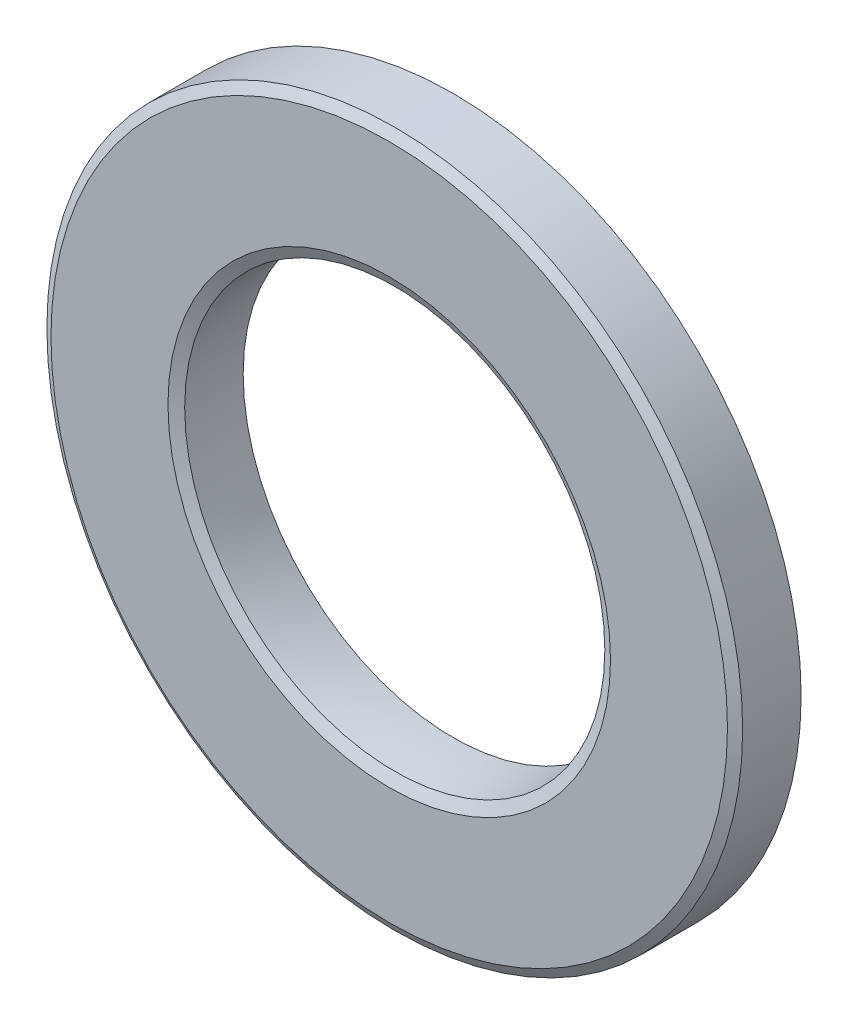
ISO-10303-21;
HEADER;
FILE_DESCRIPTION(('STEP AP214'),'2;1');
FILE_NAME('part.step','',(''),(''),'','','');
FILE_SCHEMA(('AUTOMOTIVE_DESIGN { 1 0 10303 214 1 1 1 1 }'));
ENDSEC;
DATA;
#1=APPLICATION_CONTEXT('core data for automotive mechanical design processes');
#2=APPLICATION_PROTOCOL_DEFINITION('international standard','automotive_design',2000,#1);
#3=PRODUCT_CONTEXT('',#1,'mechanical');
#4=PRODUCT('Part','Part','',(#3));
#5=PRODUCT_RELATED_PRODUCT_CATEGORY('part','',(#4));
#6=PRODUCT_DEFINITION_FORMATION('','',#4);
#7=PRODUCT_DEFINITION_CONTEXT('part definition',#1,'design');
#8=PRODUCT_DEFINITION('design','',#6,#7);
#9=PRODUCT_DEFINITION_SHAPE('','',#8);
#10=(LENGTH_UNIT() NAMED_UNIT(*) SI_UNIT(.MILLI.,.METRE.));
#11=(NAMED_UNIT(*) PLANE_ANGLE_UNIT() SI_UNIT($,.RADIAN.));
#12=(NAMED_UNIT(*) SI_UNIT($,.STERADIAN.) SOLID_ANGLE_UNIT());
#13=UNCERTAINTY_MEASURE_WITH_UNIT(LENGTH_MEASURE(1.E-05),#10,'distance_accuracy_value','');
#14=(GEOMETRIC_REPRESENTATION_CONTEXT(3) GLOBAL_UNCERTAINTY_ASSIGNED_CONTEXT((#13)) GLOBAL_UNIT_ASSIGNED_CONTEXT((#10,
#11,#12)) REPRESENTATION_CONTEXT('',''));
#15=CARTESIAN_POINT('',(0.,0.,0.));
#16=DIRECTION('',(0.,0.,1.));
#17=DIRECTION('',(1.,0.,0.));
#18=AXIS2_PLACEMENT_3D('',#15,#16,#17);
#19=CARTESIAN_POINT('',(0.,0.,1.5875));
#20=DIRECTION('',(0.,0.,1.));
#21=DIRECTION('',(1.,0.,0.));
#22=AXIS2_PLACEMENT_3D('',#19,#20,#21);
#23=PLANE('',#22);
#24=CARTESIAN_POINT('',(0.,0.,1.5875));
#25=DIRECTION('',(0.,0.,1.));
#26=DIRECTION('',(1.,0.,0.));
#27=AXIS2_PLACEMENT_3D('',#24,#25,#26);
#28=CIRCLE('',#27,10.0970666059521);
#29=CARTESIAN_POINT('',(10.0970666059521,0.,1.5875));
#30=VERTEX_POINT('',#29);
#31=EDGE_CURVE('E10',#30,#30,#28,.F.);
#32=ORIENTED_EDGE('',*,*,#31,.T.);
#33=EDGE_LOOP('',(#32));
#34=FACE_BOUND('',#33,.T.);
#35=CARTESIAN_POINT('',(0.,0.,1.5875));
#36=DIRECTION('',(0.,0.,1.));
#37=DIRECTION('',(1.,0.,0.));
#38=AXIS2_PLACEMENT_3D('',#35,#36,#37);
#39=CIRCLE('',#38,15.4350590948775);
#40=CARTESIAN_POINT('',(15.4350590948775,0.,1.5875));
#41=VERTEX_POINT('',#40);
#42=EDGE_CURVE('E63',#41,#41,#39,.T.);
#43=ORIENTED_EDGE('',*,*,#42,.T.);
#44=EDGE_LOOP('',(#43));
#45=FACE_BOUND('',#44,.T.);
#46=ADVANCED_FACE('F43',(#34,#45),#23,.T.);
#47=CARTESIAN_POINT('',(0.,0.,1.5875));
#48=DIRECTION('',(0.,0.,-1.));
#49=DIRECTION('',(-1.,0.,0.));
#50=AXIS2_PLACEMENT_3D('',#47,#48,#49);
#51=CYLINDRICAL_SURFACE('',#50,15.875);
#52=CARTESIAN_POINT('',(0.,0.,-1.33350000000002));
#53=DIRECTION('',(0.,0.,1.));
#54=DIRECTION('',(1.,0.,0.));
#55=AXIS2_PLACEMENT_3D('',#52,#53,#54);
#56=CIRCLE('',#55,15.875);
#57=CARTESIAN_POINT('',(-15.875,0.,-1.33350000000002));
#58=VERTEX_POINT('',#57);
#59=EDGE_CURVE('E69',#58,#58,#56,.T.);
#60=CARTESIAN_POINT('',(0.,0.,1.33350000000001));
#61=DIRECTION('',(0.,0.,1.));
#62=DIRECTION('',(1.,0.,0.));
#63=AXIS2_PLACEMENT_3D('',#60,#61,#62);
#64=CIRCLE('',#63,15.875);
#65=CARTESIAN_POINT('',(-15.875,0.,1.33350000000001));
#66=VERTEX_POINT('',#65);
#67=EDGE_CURVE('E72',#66,#66,#64,.F.);
#68=CARTESIAN_POINT('',(-15.875,0.,-1.33350000000002));
#69=CARTESIAN_POINT('',(-15.875,0.,-1.30571875000002));
#70=CARTESIAN_POINT('',(-15.875,0.,-1.27793750000002));
#71=CARTESIAN_POINT('',(-15.875,0.,-1.22237500000002));
#72=CARTESIAN_POINT('',(-15.875,0.,-1.19459375000002));
#73=CARTESIAN_POINT('',(-15.875,0.,-1.13903125000002));
#74=CARTESIAN_POINT('',(-15.875,0.,-1.11125000000002));
#75=CARTESIAN_POINT('',(-15.875,0.,-1.05568750000001));
#76=CARTESIAN_POINT('',(-15.875,0.,-1.02790625000001));
#77=CARTESIAN_POINT('',(-15.875,0.,-0.972343750000014));
#78=CARTESIAN_POINT('',(-15.875,0.,-0.944562500000014));
#79=CARTESIAN_POINT('',(-15.875,0.,-0.889000000000013));
#80=CARTESIAN_POINT('',(-15.875,0.,-0.861218750000013));
#81=CARTESIAN_POINT('',(-15.875,0.,-0.805656250000012));
#82=CARTESIAN_POINT('',(-15.875,0.,-0.777875000000012));
#83=CARTESIAN_POINT('',(-15.875,0.,-0.722312500000011));
#84=CARTESIAN_POINT('',(-15.875,0.,-0.694531250000011));
#85=CARTESIAN_POINT('',(-15.875,0.,-0.638968750000011));
#86=CARTESIAN_POINT('',(-15.875,0.,-0.61118750000001));
#87=CARTESIAN_POINT('',(-15.875,0.,-0.55562500000001));
#88=CARTESIAN_POINT('',(-15.875,0.,-0.527843750000009));
#89=CARTESIAN_POINT('',(-15.875,0.,-0.472281250000009));
#90=CARTESIAN_POINT('',(-15.875,0.,-0.444500000000009));
#91=CARTESIAN_POINT('',(-15.875,0.,-0.388937500000008));
#92=CARTESIAN_POINT('',(-15.875,0.,-0.361156250000008));
#93=CARTESIAN_POINT('',(-15.875,0.,-0.305593750000007));
#94=CARTESIAN_POINT('',(-15.875,0.,-0.277812500000007));
#95=CARTESIAN_POINT('',(-15.875,0.,-0.222250000000007));
#96=CARTESIAN_POINT('',(-15.875,0.,-0.194468750000006));
#97=CARTESIAN_POINT('',(-15.875,0.,-0.138906250000006));
#98=CARTESIAN_POINT('',(-15.875,0.,-0.111125000000006));
#99=CARTESIAN_POINT('',(-15.875,0.,-0.055562500000005));
#100=CARTESIAN_POINT('',(-15.875,0.,-0.0277812500000046));
#101=CARTESIAN_POINT('',(-15.875,0.,0.027781249999996));
#102=CARTESIAN_POINT('',(-15.875,0.,0.0555624999999963));
#103=CARTESIAN_POINT('',(-15.875,0.,0.111124999999997));
#104=CARTESIAN_POINT('',(-15.875,0.,0.138906249999997));
#105=CARTESIAN_POINT('',(-15.875,0.,0.194468749999998));
#106=CARTESIAN_POINT('',(-15.875,0.,0.222249999999998));
#107=CARTESIAN_POINT('',(-15.875,0.,0.277812499999998));
#108=CARTESIAN_POINT('',(-15.875,0.,0.305593749999999));
#109=CARTESIAN_POINT('',(-15.875,0.,0.361156249999999));
#110=CARTESIAN_POINT('',(-15.875,0.,0.3889375));
#111=CARTESIAN_POINT('',(-15.875,0.,0.4445));
#112=CARTESIAN_POINT('',(-15.875,0.,0.47228125));
#113=CARTESIAN_POINT('',(-15.875,0.,0.527843750000001));
#114=CARTESIAN_POINT('',(-15.875,0.,0.555625000000001));
#115=CARTESIAN_POINT('',(-15.875,0.,0.611187500000002));
#116=CARTESIAN_POINT('',(-15.875,0.,0.638968750000002));
#117=CARTESIAN_POINT('',(-15.875,0.,0.694531250000003));
#118=CARTESIAN_POINT('',(-15.875,0.,0.722312500000003));
#119=CARTESIAN_POINT('',(-15.875,0.,0.777875000000004));
#120=CARTESIAN_POINT('',(-15.875,0.,0.805656250000004));
#121=CARTESIAN_POINT('',(-15.875,0.,0.861218750000004));
#122=CARTESIAN_POINT('',(-15.875,0.,0.889000000000005));
#123=CARTESIAN_POINT('',(-15.875,0.,0.944562500000005));
#124=CARTESIAN_POINT('',(-15.875,0.,0.972343750000005));
#125=CARTESIAN_POINT('',(-15.875,0.,1.02790625000001));
#126=CARTESIAN_POINT('',(-15.875,0.,1.05568750000001));
#127=CARTESIAN_POINT('',(-15.875,0.,1.11125000000001));
#128=CARTESIAN_POINT('',(-15.875,0.,1.13903125000001));
#129=CARTESIAN_POINT('',(-15.875,0.,1.19459375000001));
#130=CARTESIAN_POINT('',(-15.875,0.,1.22237500000001));
#131=CARTESIAN_POINT('',(-15.875,0.,1.27793750000001));
#132=CARTESIAN_POINT('',(-15.875,0.,1.30571875000001));
#133=CARTESIAN_POINT('',(-15.875,0.,1.33350000000001));
#134=B_SPLINE_CURVE_WITH_KNOTS('',3,(#68,#69,#70,#71,#72,#73,#74,#75,#76,#77,#78,#79,#80,#81,
#82,#83,#84,#85,#86,#87,#88,#89,#90,#91,#92,#93,#94,#95,#96,#97,#98,#99,#100,#101,#102,#103,
#104,#105,#106,#107,#108,#109,#110,#111,#112,#113,#114,#115,#116,#117,#118,#119,#120,#121,#122,
#123,#124,#125,#126,#127,#128,#129,#130,#131,#132,#133),.UNSPECIFIED.,.F.,.F.,(4,2,2,2,2,2,2,2,
2,2,2,2,2,2,2,2,2,2,2,2,2,2,2,2,2,2,2,2,2,2,2,2,4),(0.,0.083343750000001,0.166687500000002,
0.250031250000002,0.333375000000003,0.416718750000004,0.500062500000005,0.583406250000006,
0.666750000000007,0.750093750000008,0.833437500000009,0.916781250000009,1.00012500000001,
1.08346875000001,1.16681250000001,1.25015625000001,1.33350000000001,1.41684375000001,
1.50018750000001,1.58353125000002,1.66687500000002,1.75021875000002,1.83356250000002,
1.91690625000002,2.00025000000002,2.08359375000002,2.16693750000002,2.25028125000002,
2.33362500000002,2.41696875000002,2.50031250000002,2.58365625000003,2.66700000000003),.UNSPECIFIED.);
#135=EDGE_CURVE('BSEAM76',#58,#66,#134,.T.);
#136=ORIENTED_EDGE('',*,*,#59,.T.);
#137=ORIENTED_EDGE('',*,*,#67,.T.);
#138=ORIENTED_EDGE('',*,*,#135,.T.);
#139=ORIENTED_EDGE('',*,*,#135,.F.);
#140=EDGE_LOOP('',(#136,#138,#137,#139));
#141=FACE_BOUND('',#140,.T.);
#142=ADVANCED_FACE('F76',(#141),#51,.T.);
#143=CARTESIAN_POINT('',(0.,0.,-1.5875));
#144=DIRECTION('',(0.,0.,1.));
#145=DIRECTION('',(1.,0.,0.));
#146=AXIS2_PLACEMENT_3D('',#143,#144,#145);
#147=PLANE('',#146);
#148=CARTESIAN_POINT('',(0.,0.,-1.5875));
#149=DIRECTION('',(0.,0.,1.));
#150=DIRECTION('',(1.,0.,0.));
#151=AXIS2_PLACEMENT_3D('',#148,#149,#150);
#152=CIRCLE('',#151,10.0970666059521);
#153=CARTESIAN_POINT('',(10.0970666059521,0.,-1.5875));
#154=VERTEX_POINT('',#153);
#155=EDGE_CURVE('E58',#154,#154,#152,.T.);
#156=ORIENTED_EDGE('',*,*,#155,.T.);
#157=EDGE_LOOP('',(#156));
#158=FACE_BOUND('',#157,.T.);
#159=CARTESIAN_POINT('',(0.,0.,-1.5875));
#160=DIRECTION('',(0.,0.,1.));
#161=DIRECTION('',(1.,0.,0.));
#162=AXIS2_PLACEMENT_3D('',#159,#160,#161);
#163=CIRCLE('',#162,15.4350590948775);
#164=CARTESIAN_POINT('',(15.4350590948775,0.,-1.5875));
#165=VERTEX_POINT('',#164);
#166=EDGE_CURVE('E66',#165,#165,#163,.F.);
#167=ORIENTED_EDGE('',*,*,#166,.T.);
#168=EDGE_LOOP('',(#167));
#169=FACE_BOUND('',#168,.T.);
#170=ADVANCED_FACE('F92',(#158,#169),#147,.F.);
#171=CARTESIAN_POINT('',(0.,0.,-1.33350000000002));
#172=DIRECTION('',(0.,0.,1.));
#173=DIRECTION('',(1.,0.,0.));
#174=AXIS2_PLACEMENT_3D('',#171,#172,#173);
#175=CONICAL_SURFACE('',#174,15.875,1.0471975511966);
#176=ORIENTED_EDGE('',*,*,#166,.F.);
#177=EDGE_LOOP('',(#176));
#178=FACE_BOUND('',#177,.T.);
#179=ORIENTED_EDGE('',*,*,#59,.F.);
#180=EDGE_LOOP('',(#179));
#181=FACE_BOUND('',#180,.T.);
#182=ADVANCED_FACE('F82',(#178,#181),#175,.T.);
#183=CARTESIAN_POINT('',(0.,0.,1.5875));
#184=DIRECTION('',(0.,0.,-1.));
#185=DIRECTION('',(-1.,0.,0.));
#186=AXIS2_PLACEMENT_3D('',#183,#184,#185);
#187=CONICAL_SURFACE('',#186,15.4350590948775,1.0471975511966);
#188=ORIENTED_EDGE('',*,*,#67,.F.);
#189=EDGE_LOOP('',(#188));
#190=FACE_BOUND('',#189,.T.);
#191=ORIENTED_EDGE('',*,*,#42,.F.);
#192=EDGE_LOOP('',(#191));
#193=FACE_BOUND('',#192,.T.);
#194=ADVANCED_FACE('F78',(#190,#193),#187,.T.);
#195=CARTESIAN_POINT('',(0.,0.,0.));
#196=DIRECTION('',(0.,0.,1.));
#197=DIRECTION('',(0.,-1.,0.));
#198=AXIS2_PLACEMENT_3D('',#195,#196,#197);
#199=TOROIDAL_SURFACE('',#198,34.3804874999998,24.8300874999997);
#200=CARTESIAN_POINT('',(0.,0.,-1.33468124480383));
#201=DIRECTION('',(0.,0.,1.));
#202=DIRECTION('',(1.,0.,0.));
#203=AXIS2_PLACEMENT_3D('',#200,#201,#202);
#204=CIRCLE('',#203,9.58629722823623);
#205=CARTESIAN_POINT('',(9.58629722823623,0.,-1.33468124480383));
#206=VERTEX_POINT('',#205);
#207=EDGE_CURVE('E50',#206,#206,#204,.F.);
#208=ORIENTED_EDGE('',*,*,#207,.T.);
#209=EDGE_LOOP('',(#208));
#210=FACE_BOUND('',#209,.T.);
#211=CARTESIAN_POINT('',(0.,0.,1.33468124480382));
#212=DIRECTION('',(0.,0.,-1.));
#213=DIRECTION('',(-1.,0.,0.));
#214=AXIS2_PLACEMENT_3D('',#211,#212,#213);
#215=CIRCLE('',#214,9.58629722823623);
#216=CARTESIAN_POINT('',(-9.58629722823623,0.,1.33468124480382));
#217=VERTEX_POINT('',#216);
#218=EDGE_CURVE('E54',#217,#217,#215,.F.);
#219=ORIENTED_EDGE('',*,*,#218,.T.);
#220=EDGE_LOOP('',(#219));
#221=FACE_BOUND('',#220,.T.);
#222=ADVANCED_FACE('F81',(#210,#221),#199,.T.);
#223=CARTESIAN_POINT('',(0.,0.,-1.5875));
#224=DIRECTION('',(0.,0.,-1.));
#225=DIRECTION('',(-1.,0.,0.));
#226=AXIS2_PLACEMENT_3D('',#223,#224,#225);
#227=CONICAL_SURFACE('',#226,10.0970666059521,1.11117571927522);
#228=ORIENTED_EDGE('',*,*,#207,.F.);
#229=EDGE_LOOP('',(#228));
#230=FACE_BOUND('',#229,.T.);
#231=ORIENTED_EDGE('',*,*,#155,.F.);
#232=EDGE_LOOP('',(#231));
#233=FACE_BOUND('',#232,.T.);
#234=ADVANCED_FACE('F100',(#230,#233),#227,.F.);
#235=CARTESIAN_POINT('',(0.,0.,1.33468124480382));
#236=DIRECTION('',(0.,0.,1.));
#237=DIRECTION('',(1.,0.,0.));
#238=AXIS2_PLACEMENT_3D('',#235,#236,#237);
#239=CONICAL_SURFACE('',#238,9.58629722823623,1.11117571927522);
#240=ORIENTED_EDGE('',*,*,#31,.F.);
#241=EDGE_LOOP('',(#240));
#242=FACE_BOUND('',#241,.T.);
#243=ORIENTED_EDGE('',*,*,#218,.F.);
#244=EDGE_LOOP('',(#243));
#245=FACE_BOUND('',#244,.T.);
#246=ADVANCED_FACE('F45',(#242,#245),#239,.F.);
#247=CLOSED_SHELL('',(#46,#142,#170,#182,#194,#222,#234,#246));
#248=MANIFOLD_SOLID_BREP('B2',#247);
#249=ADVANCED_BREP_SHAPE_REPRESENTATION('',(#18,#248),#14);
#250=SHAPE_DEFINITION_REPRESENTATION(#9,#249);
ENDSEC;
END-ISO-10303-21;
